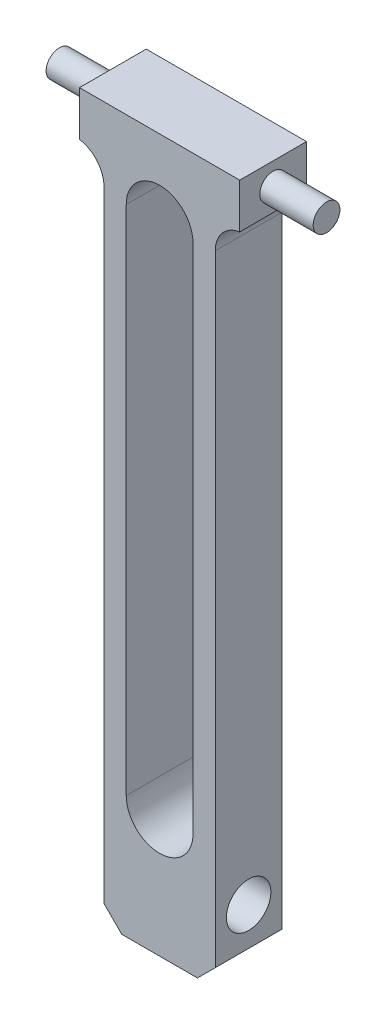
ISO-10303-21;
HEADER;
FILE_DESCRIPTION(('STEP AP214'),'2;1');
FILE_NAME('part.step','',(''),(''),'','','');
FILE_SCHEMA(('AUTOMOTIVE_DESIGN { 1 0 10303 214 1 1 1 1 }'));
ENDSEC;
DATA;
#1=APPLICATION_CONTEXT('core data for automotive mechanical design processes');
#2=APPLICATION_PROTOCOL_DEFINITION('international standard','automotive_design',2000,#1);
#3=PRODUCT_CONTEXT('',#1,'mechanical');
#4=PRODUCT('Part','Part','',(#3));
#5=PRODUCT_RELATED_PRODUCT_CATEGORY('part','',(#4));
#6=PRODUCT_DEFINITION_FORMATION('','',#4);
#7=PRODUCT_DEFINITION_CONTEXT('part definition',#1,'design');
#8=PRODUCT_DEFINITION('design','',#6,#7);
#9=PRODUCT_DEFINITION_SHAPE('','',#8);
#10=(LENGTH_UNIT() NAMED_UNIT(*) SI_UNIT(.MILLI.,.METRE.));
#11=(NAMED_UNIT(*) PLANE_ANGLE_UNIT() SI_UNIT($,.RADIAN.));
#12=(NAMED_UNIT(*) SI_UNIT($,.STERADIAN.) SOLID_ANGLE_UNIT());
#13=UNCERTAINTY_MEASURE_WITH_UNIT(LENGTH_MEASURE(1.E-05),#10,'distance_accuracy_value','');
#14=(GEOMETRIC_REPRESENTATION_CONTEXT(3) GLOBAL_UNCERTAINTY_ASSIGNED_CONTEXT((#13)) GLOBAL_UNIT_ASSIGNED_CONTEXT((#10,
#11,#12)) REPRESENTATION_CONTEXT('',''));
#15=CARTESIAN_POINT('',(0.,0.,0.));
#16=DIRECTION('',(0.,0.,1.));
#17=DIRECTION('',(1.,0.,0.));
#18=AXIS2_PLACEMENT_3D('',#15,#16,#17);
#19=CARTESIAN_POINT('',(-8.75,80.,7.5));
#20=DIRECTION('',(0.,-1.,0.));
#21=DIRECTION('',(0.,0.,-1.));
#22=AXIS2_PLACEMENT_3D('',#19,#20,#21);
#23=PLANE('',#22);
#24=DIRECTION('',(0.,0.,-1.));
#25=VECTOR('',#24,1.);
#26=CARTESIAN_POINT('',(-2.75,80.,7.5));
#27=LINE('',#26,#25);
#28=CARTESIAN_POINT('',(-2.75,80.,7.5));
#29=VERTEX_POINT('',#28);
#30=CARTESIAN_POINT('',(-2.75,80.,0.));
#31=VERTEX_POINT('',#30);
#32=EDGE_CURVE('E153',#29,#31,#27,.T.);
#33=ORIENTED_EDGE('',*,*,#32,.F.);
#34=DIRECTION('',(-1.,0.,0.));
#35=VECTOR('',#34,1.);
#36=CARTESIAN_POINT('',(-8.75,80.,7.5));
#37=LINE('',#36,#35);
#38=CARTESIAN_POINT('',(15.2499999999999,80.,7.5));
#39=VERTEX_POINT('',#38);
#40=EDGE_CURVE('E152',#39,#29,#37,.T.);
#41=ORIENTED_EDGE('',*,*,#40,.F.);
#42=DIRECTION('',(0.,0.,1.));
#43=VECTOR('',#42,1.);
#44=CARTESIAN_POINT('',(15.2499999999999,80.,7.5));
#45=LINE('',#44,#43);
#46=CARTESIAN_POINT('',(15.2499999999999,80.,0.));
#47=VERTEX_POINT('',#46);
#48=EDGE_CURVE('E280',#47,#39,#45,.T.);
#49=ORIENTED_EDGE('',*,*,#48,.F.);
#50=DIRECTION('',(-1.,0.,0.));
#51=VECTOR('',#50,1.);
#52=CARTESIAN_POINT('',(-8.75,80.,0.));
#53=LINE('',#52,#51);
#54=EDGE_CURVE('E178',#47,#31,#53,.T.);
#55=ORIENTED_EDGE('',*,*,#54,.T.);
#56=EDGE_LOOP('',(#33,#41,#49,#55));
#57=FACE_BOUND('',#56,.T.);
#58=ADVANCED_FACE('F41',(#57),#23,.F.);
#59=CARTESIAN_POINT('',(15.75,71.75,7.5));
#60=DIRECTION('',(0.,0.,1.));
#61=DIRECTION('',(1.,0.,0.));
#62=AXIS2_PLACEMENT_3D('',#59,#60,#61);
#63=PLANE('',#62);
#64=CARTESIAN_POINT('',(6.25,71.25,7.5));
#65=DIRECTION('',(0.,0.,1.));
#66=DIRECTION('',(1.,0.,0.));
#67=AXIS2_PLACEMENT_3D('',#64,#65,#66);
#68=CIRCLE('',#67,3.75);
#69=CARTESIAN_POINT('',(10.,71.25,7.5));
#70=VERTEX_POINT('',#69);
#71=CARTESIAN_POINT('',(2.50000000000001,71.25,7.5));
#72=VERTEX_POINT('',#71);
#73=EDGE_CURVE('E295',#70,#72,#68,.T.);
#74=ORIENTED_EDGE('',*,*,#73,.F.);
#75=DIRECTION('',(0.,1.,0.));
#76=VECTOR('',#75,1.);
#77=CARTESIAN_POINT('',(10.,71.25,7.5));
#78=LINE('',#77,#76);
#79=CARTESIAN_POINT('',(10.,13.75,7.5));
#80=VERTEX_POINT('',#79);
#81=EDGE_CURVE('E303',#80,#70,#78,.T.);
#82=ORIENTED_EDGE('',*,*,#81,.F.);
#83=CARTESIAN_POINT('',(6.25000000000001,13.75,7.5));
#84=DIRECTION('',(0.,0.,1.));
#85=DIRECTION('',(1.,0.,0.));
#86=AXIS2_PLACEMENT_3D('',#83,#84,#85);
#87=CIRCLE('',#86,3.75);
#88=CARTESIAN_POINT('',(2.50000000000001,13.75,7.5));
#89=VERTEX_POINT('',#88);
#90=EDGE_CURVE('E300',#89,#80,#87,.T.);
#91=ORIENTED_EDGE('',*,*,#90,.F.);
#92=DIRECTION('',(0.,-1.,0.));
#93=VECTOR('',#92,1.);
#94=CARTESIAN_POINT('',(2.5,71.25,7.5));
#95=LINE('',#94,#93);
#96=EDGE_CURVE('E297',#72,#89,#95,.T.);
#97=ORIENTED_EDGE('',*,*,#96,.F.);
#98=EDGE_LOOP('',(#74,#82,#91,#97));
#99=FACE_BOUND('',#98,.T.);
#100=ORIENTED_EDGE('',*,*,#40,.T.);
#101=DIRECTION('',(0.,-1.,0.));
#102=VECTOR('',#101,1.);
#103=CARTESIAN_POINT('',(-2.75,71.75,7.5));
#104=LINE('',#103,#102);
#105=CARTESIAN_POINT('',(-2.75,74.9613081446663,7.5));
#106=VERTEX_POINT('',#105);
#107=EDGE_CURVE('E140',#29,#106,#104,.T.);
#108=ORIENTED_EDGE('',*,*,#107,.T.);
#109=CARTESIAN_POINT('',(-3.25,71.75,7.5));
#110=DIRECTION('',(0.,0.,-1.));
#111=DIRECTION('',(-1.,0.,0.));
#112=AXIS2_PLACEMENT_3D('',#109,#110,#111);
#113=CIRCLE('',#112,3.25);
#114=CARTESIAN_POINT('',(0.,71.75,7.5));
#115=VERTEX_POINT('',#114);
#116=EDGE_CURVE('E148',#106,#115,#113,.T.);
#117=ORIENTED_EDGE('',*,*,#116,.T.);
#118=DIRECTION('',(0.,-1.,0.));
#119=VECTOR('',#118,1.);
#120=CARTESIAN_POINT('',(0.,2.,7.5));
#121=LINE('',#120,#119);
#122=CARTESIAN_POINT('',(0.,2.,7.5));
#123=VERTEX_POINT('',#122);
#124=EDGE_CURVE('E159',#115,#123,#121,.T.);
#125=ORIENTED_EDGE('',*,*,#124,.T.);
#126=DIRECTION('',(0.707106781186548,-0.707106781186548,0.));
#127=VECTOR('',#126,1.);
#128=CARTESIAN_POINT('',(0.,2.,7.5));
#129=LINE('',#128,#127);
#130=CARTESIAN_POINT('',(2.,0.,7.5));
#131=VERTEX_POINT('',#130);
#132=EDGE_CURVE('E161',#123,#131,#129,.T.);
#133=ORIENTED_EDGE('',*,*,#132,.T.);
#134=DIRECTION('',(1.,0.,0.));
#135=VECTOR('',#134,1.);
#136=CARTESIAN_POINT('',(2.,0.,7.5));
#137=LINE('',#136,#135);
#138=CARTESIAN_POINT('',(10.5,0.,7.5));
#139=VERTEX_POINT('',#138);
#140=EDGE_CURVE('E168',#131,#139,#137,.T.);
#141=ORIENTED_EDGE('',*,*,#140,.T.);
#142=DIRECTION('',(0.707106781186548,0.707106781186548,0.));
#143=VECTOR('',#142,1.);
#144=CARTESIAN_POINT('',(10.5,0.,7.5));
#145=LINE('',#144,#143);
#146=CARTESIAN_POINT('',(12.5,2.,7.5));
#147=VERTEX_POINT('',#146);
#148=EDGE_CURVE('E170',#139,#147,#145,.T.);
#149=ORIENTED_EDGE('',*,*,#148,.T.);
#150=DIRECTION('',(0.,1.,0.));
#151=VECTOR('',#150,1.);
#152=CARTESIAN_POINT('',(12.5,2.,7.5));
#153=LINE('',#152,#151);
#154=CARTESIAN_POINT('',(12.5,71.75,7.5));
#155=VERTEX_POINT('',#154);
#156=EDGE_CURVE('E172',#147,#155,#153,.T.);
#157=ORIENTED_EDGE('',*,*,#156,.T.);
#158=CARTESIAN_POINT('',(15.75,71.75,7.5));
#159=DIRECTION('',(0.,0.,-1.));
#160=DIRECTION('',(1.,0.,0.));
#161=AXIS2_PLACEMENT_3D('',#158,#159,#160);
#162=CIRCLE('',#161,3.25);
#163=CARTESIAN_POINT('',(15.2499999999999,74.9613081446663,7.5));
#164=VERTEX_POINT('',#163);
#165=EDGE_CURVE('E163',#155,#164,#162,.T.);
#166=ORIENTED_EDGE('',*,*,#165,.T.);
#167=DIRECTION('',(0.,1.,0.));
#168=VECTOR('',#167,1.);
#169=CARTESIAN_POINT('',(15.2499999999999,71.75,7.5));
#170=LINE('',#169,#168);
#171=EDGE_CURVE('E286',#164,#39,#170,.T.);
#172=ORIENTED_EDGE('',*,*,#171,.T.);
#173=EDGE_LOOP('',(#100,#108,#117,#125,#133,#141,#149,#157,#166,#172));
#174=FACE_BOUND('',#173,.T.);
#175=ADVANCED_FACE('F147',(#99,#174),#63,.T.);
#176=CARTESIAN_POINT('',(15.75,71.75,0.));
#177=DIRECTION('',(0.,0.,1.));
#178=DIRECTION('',(1.,0.,0.));
#179=AXIS2_PLACEMENT_3D('',#176,#177,#178);
#180=PLANE('',#179);
#181=DIRECTION('',(0.,1.,0.));
#182=VECTOR('',#181,1.);
#183=CARTESIAN_POINT('',(10.,71.75,0.));
#184=LINE('',#183,#182);
#185=CARTESIAN_POINT('',(10.,13.75,0.));
#186=VERTEX_POINT('',#185);
#187=CARTESIAN_POINT('',(10.,71.25,0.));
#188=VERTEX_POINT('',#187);
#189=EDGE_CURVE('E215',#186,#188,#184,.T.);
#190=ORIENTED_EDGE('',*,*,#189,.T.);
#191=CARTESIAN_POINT('',(6.25,71.25,0.));
#192=DIRECTION('',(0.,0.,1.));
#193=DIRECTION('',(1.,0.,0.));
#194=AXIS2_PLACEMENT_3D('',#191,#192,#193);
#195=CIRCLE('',#194,3.75);
#196=CARTESIAN_POINT('',(2.5,71.25,0.));
#197=VERTEX_POINT('',#196);
#198=EDGE_CURVE('E218',#188,#197,#195,.T.);
#199=ORIENTED_EDGE('',*,*,#198,.T.);
#200=DIRECTION('',(0.,-1.,0.));
#201=VECTOR('',#200,1.);
#202=CARTESIAN_POINT('',(2.50000000000001,71.75,0.));
#203=LINE('',#202,#201);
#204=CARTESIAN_POINT('',(2.50000000000001,13.75,0.));
#205=VERTEX_POINT('',#204);
#206=EDGE_CURVE('E209',#197,#205,#203,.T.);
#207=ORIENTED_EDGE('',*,*,#206,.T.);
#208=CARTESIAN_POINT('',(6.25000000000001,13.75,0.));
#209=DIRECTION('',(0.,0.,1.));
#210=DIRECTION('',(1.,0.,0.));
#211=AXIS2_PLACEMENT_3D('',#208,#209,#210);
#212=CIRCLE('',#211,3.75);
#213=EDGE_CURVE('E212',#205,#186,#212,.T.);
#214=ORIENTED_EDGE('',*,*,#213,.T.);
#215=EDGE_LOOP('',(#190,#199,#207,#214));
#216=FACE_BOUND('',#215,.T.);
#217=DIRECTION('',(0.,-1.,0.));
#218=VECTOR('',#217,1.);
#219=CARTESIAN_POINT('',(-2.75,71.75,0.));
#220=LINE('',#219,#218);
#221=CARTESIAN_POINT('',(-2.75,74.9613081446663,0.));
#222=VERTEX_POINT('',#221);
#223=EDGE_CURVE('E55',#31,#222,#220,.T.);
#224=ORIENTED_EDGE('',*,*,#223,.F.);
#225=ORIENTED_EDGE('',*,*,#54,.F.);
#226=DIRECTION('',(0.,1.,0.));
#227=VECTOR('',#226,1.);
#228=CARTESIAN_POINT('',(15.2499999999999,71.75,0.));
#229=LINE('',#228,#227);
#230=CARTESIAN_POINT('',(15.2499999999999,74.9613081446663,0.));
#231=VERTEX_POINT('',#230);
#232=EDGE_CURVE('E49',#231,#47,#229,.T.);
#233=ORIENTED_EDGE('',*,*,#232,.F.);
#234=CARTESIAN_POINT('',(15.75,71.75,0.));
#235=DIRECTION('',(0.,0.,-1.));
#236=DIRECTION('',(1.,0.,0.));
#237=AXIS2_PLACEMENT_3D('',#234,#235,#236);
#238=CIRCLE('',#237,3.25);
#239=CARTESIAN_POINT('',(12.5,71.75,0.));
#240=VERTEX_POINT('',#239);
#241=EDGE_CURVE('E175',#240,#231,#238,.T.);
#242=ORIENTED_EDGE('',*,*,#241,.F.);
#243=DIRECTION('',(0.,1.,0.));
#244=VECTOR('',#243,1.);
#245=CARTESIAN_POINT('',(12.5,2.,0.));
#246=LINE('',#245,#244);
#247=CARTESIAN_POINT('',(12.5,2.,0.));
#248=VERTEX_POINT('',#247);
#249=EDGE_CURVE('E192',#248,#240,#246,.T.);
#250=ORIENTED_EDGE('',*,*,#249,.F.);
#251=DIRECTION('',(0.707106781186548,0.707106781186548,0.));
#252=VECTOR('',#251,1.);
#253=CARTESIAN_POINT('',(10.5,0.,0.));
#254=LINE('',#253,#252);
#255=CARTESIAN_POINT('',(10.5,0.,0.));
#256=VERTEX_POINT('',#255);
#257=EDGE_CURVE('E190',#256,#248,#254,.T.);
#258=ORIENTED_EDGE('',*,*,#257,.F.);
#259=DIRECTION('',(1.,0.,0.));
#260=VECTOR('',#259,1.);
#261=CARTESIAN_POINT('',(2.,0.,0.));
#262=LINE('',#261,#260);
#263=CARTESIAN_POINT('',(2.,0.,0.));
#264=VERTEX_POINT('',#263);
#265=EDGE_CURVE('E188',#264,#256,#262,.T.);
#266=ORIENTED_EDGE('',*,*,#265,.F.);
#267=DIRECTION('',(0.707106781186548,-0.707106781186548,0.));
#268=VECTOR('',#267,1.);
#269=CARTESIAN_POINT('',(0.,2.,0.));
#270=LINE('',#269,#268);
#271=CARTESIAN_POINT('',(0.,2.,0.));
#272=VERTEX_POINT('',#271);
#273=EDGE_CURVE('E186',#272,#264,#270,.T.);
#274=ORIENTED_EDGE('',*,*,#273,.F.);
#275=DIRECTION('',(0.,-1.,0.));
#276=VECTOR('',#275,1.);
#277=CARTESIAN_POINT('',(0.,2.,0.));
#278=LINE('',#277,#276);
#279=CARTESIAN_POINT('',(0.,71.75,0.));
#280=VERTEX_POINT('',#279);
#281=EDGE_CURVE('E184',#280,#272,#278,.T.);
#282=ORIENTED_EDGE('',*,*,#281,.F.);
#283=CARTESIAN_POINT('',(-3.25,71.75,0.));
#284=DIRECTION('',(0.,0.,-1.));
#285=DIRECTION('',(-1.,0.,0.));
#286=AXIS2_PLACEMENT_3D('',#283,#284,#285);
#287=CIRCLE('',#286,3.25);
#288=EDGE_CURVE('E182',#222,#280,#287,.T.);
#289=ORIENTED_EDGE('',*,*,#288,.F.);
#290=EDGE_LOOP('',(#224,#225,#233,#242,#250,#258,#266,#274,#282,#289));
#291=FACE_BOUND('',#290,.T.);
#292=ADVANCED_FACE('F265',(#216,#291),#180,.F.);
#293=CARTESIAN_POINT('',(-3.25,71.75,7.5));
#294=DIRECTION('',(0.,0.,-1.));
#295=DIRECTION('',(-1.,0.,0.));
#296=AXIS2_PLACEMENT_3D('',#293,#294,#295);
#297=CYLINDRICAL_SURFACE('',#296,3.25);
#298=DIRECTION('',(0.,0.,-1.));
#299=VECTOR('',#298,1.);
#300=CARTESIAN_POINT('',(-2.75,74.9613081446663,7.5));
#301=LINE('',#300,#299);
#302=EDGE_CURVE('E13',#222,#106,#301,.F.);
#303=ORIENTED_EDGE('',*,*,#302,.F.);
#304=ORIENTED_EDGE('',*,*,#288,.T.);
#305=DIRECTION('',(0.,0.,-1.));
#306=VECTOR('',#305,1.);
#307=CARTESIAN_POINT('',(0.,71.75,7.5));
#308=LINE('',#307,#306);
#309=EDGE_CURVE('E157',#115,#280,#308,.T.);
#310=ORIENTED_EDGE('',*,*,#309,.F.);
#311=ORIENTED_EDGE('',*,*,#116,.F.);
#312=EDGE_LOOP('',(#303,#304,#310,#311));
#313=FACE_BOUND('',#312,.T.);
#314=ADVANCED_FACE('F155',(#313),#297,.F.);
#315=CARTESIAN_POINT('',(15.75,71.75,7.5));
#316=DIRECTION('',(0.,0.,-1.));
#317=DIRECTION('',(-1.,0.,0.));
#318=AXIS2_PLACEMENT_3D('',#315,#316,#317);
#319=CYLINDRICAL_SURFACE('',#318,3.25);
#320=DIRECTION('',(0.,0.,-1.));
#321=VECTOR('',#320,1.);
#322=CARTESIAN_POINT('',(15.2499999999999,74.9613081446663,7.5));
#323=LINE('',#322,#321);
#324=EDGE_CURVE('E63',#164,#231,#323,.T.);
#325=ORIENTED_EDGE('',*,*,#324,.F.);
#326=ORIENTED_EDGE('',*,*,#165,.F.);
#327=DIRECTION('',(0.,0.,-1.));
#328=VECTOR('',#327,1.);
#329=CARTESIAN_POINT('',(12.5,71.75,7.5));
#330=LINE('',#329,#328);
#331=EDGE_CURVE('E174',#155,#240,#330,.T.);
#332=ORIENTED_EDGE('',*,*,#331,.T.);
#333=ORIENTED_EDGE('',*,*,#241,.T.);
#334=EDGE_LOOP('',(#325,#326,#332,#333));
#335=FACE_BOUND('',#334,.T.);
#336=ADVANCED_FACE('F43',(#335),#319,.F.);
#337=CARTESIAN_POINT('',(0.,2.,7.5));
#338=DIRECTION('',(1.,0.,0.));
#339=DIRECTION('',(0.,0.,-1.));
#340=AXIS2_PLACEMENT_3D('',#337,#338,#339);
#341=PLANE('',#340);
#342=CARTESIAN_POINT('',(0.,6.25,3.75));
#343=DIRECTION('',(1.,0.,0.));
#344=DIRECTION('',(0.,0.,-1.));
#345=AXIS2_PLACEMENT_3D('',#342,#343,#344);
#346=CIRCLE('',#345,2.5);
#347=CARTESIAN_POINT('',(0.,6.25,1.25));
#348=VERTEX_POINT('',#347);
#349=EDGE_CURVE('E292',#348,#348,#346,.T.);
#350=ORIENTED_EDGE('',*,*,#349,.T.);
#351=EDGE_LOOP('',(#350));
#352=FACE_BOUND('',#351,.T.);
#353=ORIENTED_EDGE('',*,*,#281,.T.);
#354=DIRECTION('',(0.,0.,-1.));
#355=VECTOR('',#354,1.);
#356=CARTESIAN_POINT('',(0.,2.,7.5));
#357=LINE('',#356,#355);
#358=EDGE_CURVE('E205',#123,#272,#357,.T.);
#359=ORIENTED_EDGE('',*,*,#358,.F.);
#360=ORIENTED_EDGE('',*,*,#124,.F.);
#361=ORIENTED_EDGE('',*,*,#309,.T.);
#362=EDGE_LOOP('',(#353,#359,#360,#361));
#363=FACE_BOUND('',#362,.T.);
#364=ADVANCED_FACE('F336',(#352,#363),#341,.F.);
#365=CARTESIAN_POINT('',(0.,2.,7.5));
#366=DIRECTION('',(0.707106781186547,0.707106781186547,0.));
#367=DIRECTION('',(-0.707106781186548,0.707106781186548,0.));
#368=AXIS2_PLACEMENT_3D('',#365,#366,#367);
#369=PLANE('',#368);
#370=ORIENTED_EDGE('',*,*,#273,.T.);
#371=DIRECTION('',(0.,0.,-1.));
#372=VECTOR('',#371,1.);
#373=CARTESIAN_POINT('',(2.,0.,7.5));
#374=LINE('',#373,#372);
#375=EDGE_CURVE('E202',#131,#264,#374,.T.);
#376=ORIENTED_EDGE('',*,*,#375,.F.);
#377=ORIENTED_EDGE('',*,*,#132,.F.);
#378=ORIENTED_EDGE('',*,*,#358,.T.);
#379=EDGE_LOOP('',(#370,#376,#377,#378));
#380=FACE_BOUND('',#379,.T.);
#381=ADVANCED_FACE('F343',(#380),#369,.F.);
#382=CARTESIAN_POINT('',(2.,0.,7.5));
#383=DIRECTION('',(0.,1.,0.));
#384=DIRECTION('',(0.,0.,1.));
#385=AXIS2_PLACEMENT_3D('',#382,#383,#384);
#386=PLANE('',#385);
#387=CARTESIAN_POINT('',(6.25,0.,3.75));
#388=DIRECTION('',(0.,-1.,0.));
#389=DIRECTION('',(0.,0.,-1.));
#390=AXIS2_PLACEMENT_3D('',#387,#388,#389);
#391=CIRCLE('',#390,1.65);
#392=CARTESIAN_POINT('',(6.25,0.,2.1));
#393=VERTEX_POINT('',#392);
#394=EDGE_CURVE('E228',#393,#393,#391,.T.);
#395=ORIENTED_EDGE('',*,*,#394,.F.);
#396=EDGE_LOOP('',(#395));
#397=FACE_BOUND('',#396,.T.);
#398=ORIENTED_EDGE('',*,*,#265,.T.);
#399=DIRECTION('',(0.,0.,-1.));
#400=VECTOR('',#399,1.);
#401=CARTESIAN_POINT('',(10.5,0.,7.5));
#402=LINE('',#401,#400);
#403=EDGE_CURVE('E199',#139,#256,#402,.T.);
#404=ORIENTED_EDGE('',*,*,#403,.F.);
#405=ORIENTED_EDGE('',*,*,#140,.F.);
#406=ORIENTED_EDGE('',*,*,#375,.T.);
#407=EDGE_LOOP('',(#398,#404,#405,#406));
#408=FACE_BOUND('',#407,.T.);
#409=ADVANCED_FACE('F346',(#397,#408),#386,.F.);
#410=CARTESIAN_POINT('',(10.5,0.,7.5));
#411=DIRECTION('',(-0.707106781186547,0.707106781186547,0.));
#412=DIRECTION('',(-0.707106781186548,-0.707106781186548,0.));
#413=AXIS2_PLACEMENT_3D('',#410,#411,#412);
#414=PLANE('',#413);
#415=ORIENTED_EDGE('',*,*,#257,.T.);
#416=DIRECTION('',(0.,0.,-1.));
#417=VECTOR('',#416,1.);
#418=CARTESIAN_POINT('',(12.5,2.,7.5));
#419=LINE('',#418,#417);
#420=EDGE_CURVE('E196',#147,#248,#419,.T.);
#421=ORIENTED_EDGE('',*,*,#420,.F.);
#422=ORIENTED_EDGE('',*,*,#148,.F.);
#423=ORIENTED_EDGE('',*,*,#403,.T.);
#424=EDGE_LOOP('',(#415,#421,#422,#423));
#425=FACE_BOUND('',#424,.T.);
#426=ADVANCED_FACE('F350',(#425),#414,.F.);
#427=CARTESIAN_POINT('',(12.5,2.,7.5));
#428=DIRECTION('',(-1.,0.,0.));
#429=DIRECTION('',(0.,0.,1.));
#430=AXIS2_PLACEMENT_3D('',#427,#428,#429);
#431=PLANE('',#430);
#432=CARTESIAN_POINT('',(12.5,6.25,3.75));
#433=DIRECTION('',(1.,0.,0.));
#434=DIRECTION('',(0.,1.,0.));
#435=AXIS2_PLACEMENT_3D('',#432,#433,#434);
#436=CIRCLE('',#435,2.5);
#437=CARTESIAN_POINT('',(12.5,8.75,3.75));
#438=VERTEX_POINT('',#437);
#439=EDGE_CURVE('E227',#438,#438,#436,.T.);
#440=ORIENTED_EDGE('',*,*,#439,.F.);
#441=EDGE_LOOP('',(#440));
#442=FACE_BOUND('',#441,.T.);
#443=ORIENTED_EDGE('',*,*,#249,.T.);
#444=ORIENTED_EDGE('',*,*,#331,.F.);
#445=ORIENTED_EDGE('',*,*,#156,.F.);
#446=ORIENTED_EDGE('',*,*,#420,.T.);
#447=EDGE_LOOP('',(#443,#444,#445,#446));
#448=FACE_BOUND('',#447,.T.);
#449=ADVANCED_FACE('F352',(#442,#448),#431,.F.);
#450=CARTESIAN_POINT('',(6.25,71.25,-2.5));
#451=DIRECTION('',(0.,0.,1.));
#452=DIRECTION('',(1.,0.,0.));
#453=AXIS2_PLACEMENT_3D('',#450,#451,#452);
#454=CYLINDRICAL_SURFACE('',#453,3.75);
#455=DIRECTION('',(0.,0.,1.));
#456=VECTOR('',#455,1.);
#457=CARTESIAN_POINT('',(10.,71.25,-2.5));
#458=LINE('',#457,#456);
#459=EDGE_CURVE('E179',#188,#70,#458,.T.);
#460=ORIENTED_EDGE('',*,*,#459,.T.);
#461=ORIENTED_EDGE('',*,*,#73,.T.);
#462=DIRECTION('',(0.,0.,1.));
#463=VECTOR('',#462,1.);
#464=CARTESIAN_POINT('',(2.5,71.25,-2.5));
#465=LINE('',#464,#463);
#466=EDGE_CURVE('E306',#197,#72,#465,.T.);
#467=ORIENTED_EDGE('',*,*,#466,.F.);
#468=ORIENTED_EDGE('',*,*,#198,.F.);
#469=EDGE_LOOP('',(#460,#461,#467,#468));
#470=FACE_BOUND('',#469,.T.);
#471=ADVANCED_FACE('F354',(#470),#454,.F.);
#472=CARTESIAN_POINT('',(10.,71.25,-2.5));
#473=DIRECTION('',(1.,0.,0.));
#474=DIRECTION('',(0.,1.,0.));
#475=AXIS2_PLACEMENT_3D('',#472,#473,#474);
#476=PLANE('',#475);
#477=DIRECTION('',(0.,0.,1.));
#478=VECTOR('',#477,1.);
#479=CARTESIAN_POINT('',(10.,13.75,-2.5));
#480=LINE('',#479,#478);
#481=EDGE_CURVE('E308',#186,#80,#480,.T.);
#482=ORIENTED_EDGE('',*,*,#481,.T.);
#483=ORIENTED_EDGE('',*,*,#81,.T.);
#484=ORIENTED_EDGE('',*,*,#459,.F.);
#485=ORIENTED_EDGE('',*,*,#189,.F.);
#486=EDGE_LOOP('',(#482,#483,#484,#485));
#487=FACE_BOUND('',#486,.T.);
#488=ADVANCED_FACE('F361',(#487),#476,.F.);
#489=CARTESIAN_POINT('',(6.25000000000001,13.75,-2.5));
#490=DIRECTION('',(0.,0.,1.));
#491=DIRECTION('',(1.,0.,0.));
#492=AXIS2_PLACEMENT_3D('',#489,#490,#491);
#493=CYLINDRICAL_SURFACE('',#492,3.75);
#494=DIRECTION('',(0.,0.,1.));
#495=VECTOR('',#494,1.);
#496=CARTESIAN_POINT('',(2.50000000000001,13.75,-2.5));
#497=LINE('',#496,#495);
#498=EDGE_CURVE('E310',#205,#89,#497,.T.);
#499=ORIENTED_EDGE('',*,*,#498,.T.);
#500=ORIENTED_EDGE('',*,*,#90,.T.);
#501=ORIENTED_EDGE('',*,*,#481,.F.);
#502=ORIENTED_EDGE('',*,*,#213,.F.);
#503=EDGE_LOOP('',(#499,#500,#501,#502));
#504=FACE_BOUND('',#503,.T.);
#505=ADVANCED_FACE('F388',(#504),#493,.F.);
#506=CARTESIAN_POINT('',(2.5,71.25,-2.5));
#507=DIRECTION('',(-1.,0.,0.));
#508=DIRECTION('',(0.,-1.,0.));
#509=AXIS2_PLACEMENT_3D('',#506,#507,#508);
#510=PLANE('',#509);
#511=ORIENTED_EDGE('',*,*,#466,.T.);
#512=ORIENTED_EDGE('',*,*,#96,.T.);
#513=ORIENTED_EDGE('',*,*,#498,.F.);
#514=ORIENTED_EDGE('',*,*,#206,.F.);
#515=EDGE_LOOP('',(#511,#512,#513,#514));
#516=FACE_BOUND('',#515,.T.);
#517=ADVANCED_FACE('F395',(#516),#510,.F.);
#518=CARTESIAN_POINT('',(-8.75,6.25,3.75));
#519=DIRECTION('',(1.,0.,0.));
#520=DIRECTION('',(0.,1.,0.));
#521=AXIS2_PLACEMENT_3D('',#518,#519,#520);
#522=CYLINDRICAL_SURFACE('',#521,2.5);
#523=CARTESIAN_POINT('',(6.25,4.3718360029007,2.1));
#524=CARTESIAN_POINT('',(6.33079427655975,4.37182643259133,2.10000556927834));
#525=CARTESIAN_POINT('',(6.41162636905579,4.36652581717207,2.10598550628885));
#526=CARTESIAN_POINT('',(6.57041795060532,4.34634247758167,2.12941139749378));
#527=CARTESIAN_POINT('',(6.64837201591593,4.33144254951039,2.14687793916521));
#528=CARTESIAN_POINT('',(6.79863333158224,4.29469387243452,2.1919227246143));
#529=CARTESIAN_POINT('',(6.87098643150526,4.27291116781144,2.21940522873516));
#530=CARTESIAN_POINT('',(7.00994524738078,4.22496785724555,2.28342482258675));
#531=CARTESIAN_POINT('',(7.07654970122849,4.19880629361915,2.31996389388724));
#532=CARTESIAN_POINT('',(7.21321736687682,4.14028171437081,2.407516406981));
#533=CARTESIAN_POINT('',(7.28226727651007,4.10758053610633,2.45988579529906));
#534=CARTESIAN_POINT('',(7.41147714614391,4.04241778412018,2.57485855531519));
#535=CARTESIAN_POINT('',(7.47162860029669,4.00995646747137,2.63747159987501));
#536=CARTESIAN_POINT('',(7.58973271619889,3.9435580232284,2.78176508432311));
#537=CARTESIAN_POINT('',(7.64619090363769,3.91005359396183,2.86488835195808));
#538=CARTESIAN_POINT('',(7.74384115428655,3.85050706248544,3.04209100296853));
#539=CARTESIAN_POINT('',(7.78504992824282,3.82445679892955,3.13615824409806));
#540=CARTESIAN_POINT('',(7.84607361226672,3.78535646485073,3.32163446336672));
#541=CARTESIAN_POINT('',(7.86774914948944,3.77118808608697,3.41218892754831));
#542=CARTESIAN_POINT('',(7.89549014711654,3.75299733483391,3.59661929507354));
#543=CARTESIAN_POINT('',(7.90157471024375,3.74896254636032,3.69049099082643));
#544=CARTESIAN_POINT('',(7.89800862462096,3.75131270340461,3.8637126636379));
#545=CARTESIAN_POINT('',(7.89056933208685,3.75623343157417,3.94314050029094));
#546=CARTESIAN_POINT('',(7.86453692457822,3.77328201033626,4.09933830819111));
#547=CARTESIAN_POINT('',(7.84594298850181,3.78541039148905,4.17610808333622));
#548=CARTESIAN_POINT('',(7.79858528412734,3.8158083267573,4.32486241957616));
#549=CARTESIAN_POINT('',(7.76985022722839,3.83406053605431,4.39685981558046));
#550=CARTESIAN_POINT('',(7.70331789592823,3.87535195413217,4.53501703450329));
#551=CARTESIAN_POINT('',(7.6655189106069,3.89839206657482,4.60117575207516));
#552=CARTESIAN_POINT('',(7.5764481916351,3.95097754998643,4.73504700079131));
#553=CARTESIAN_POINT('',(7.52406230137878,3.98097943580155,4.80183695764556));
#554=CARTESIAN_POINT('',(7.41019022775839,4.0429078108246,4.92625968695308));
#555=CARTESIAN_POINT('',(7.34869006733423,4.07483721056835,4.98387810796581));
#556=CARTESIAN_POINT('',(7.20750690257425,4.14288951687365,5.09724934289722));
#557=CARTESIAN_POINT('',(7.12648069757491,4.17891571586504,5.15139996434747));
#558=CARTESIAN_POINT('',(6.95447022283534,4.24562042340631,5.24525229324493));
#559=CARTESIAN_POINT('',(6.8635034211415,4.276308074664,5.28497883258692));
#560=CARTESIAN_POINT('',(6.70004901179961,4.31978793765181,5.33906609884217));
#561=CARTESIAN_POINT('',(6.62958306194073,4.33518623606594,5.35742065844978));
#562=CARTESIAN_POINT('',(6.48568483824098,4.35843037512274,5.38471528383589));
#563=CARTESIAN_POINT('',(6.41225774603094,4.36628885885,5.39367111218458));
#564=CARTESIAN_POINT('',(6.26413898103529,4.3732436450003,5.40161100823905));
#565=CARTESIAN_POINT('',(6.18944345582033,4.37230517573112,5.40055550398267));
#566=CARTESIAN_POINT('',(6.04146670785288,4.36174085276623,5.38845508785891));
#567=CARTESIAN_POINT('',(5.96818670082213,4.35210784344964,5.37740194790477));
#568=CARTESIAN_POINT('',(5.82815606994752,4.32622679211729,5.34670654181038));
#569=CARTESIAN_POINT('',(5.7612601566981,4.3102817057114,5.32745493961549));
#570=CARTESIAN_POINT('',(5.63158821030647,4.27362524804285,5.28127715983158));
#571=CARTESIAN_POINT('',(5.56881355184297,4.25291229669646,5.2543484373163));
#572=CARTESIAN_POINT('',(5.43584653371123,4.2040797596147,5.18744371796296));
#573=CARTESIAN_POINT('',(5.36666627761783,4.17530661650061,5.14593741519331));
#574=CARTESIAN_POINT('',(5.2354540035836,4.11613692773855,5.05370192953133));
#575=CARTESIAN_POINT('',(5.17343083426984,4.08573843909979,5.00296152557762));
#576=CARTESIAN_POINT('',(5.04502279309446,4.01933895700838,4.88132559349667));
#577=CARTESIAN_POINT('',(4.98042825569478,3.98349247141671,4.80843368437051));
#578=CARTESIAN_POINT('',(4.86429294484174,3.91645258451014,4.65102913614524));
#579=CARTESIAN_POINT('',(4.81273983785047,3.88525479839333,4.56652759412081));
#580=CARTESIAN_POINT('',(4.73346296196824,3.83616071522342,4.40502243694462));
#581=CARTESIAN_POINT('',(4.70305320616478,3.81685705394067,4.3297669827615));
#582=CARTESIAN_POINT('',(4.65340770004291,3.78499655796554,4.1743057177981));
#583=CARTESIAN_POINT('',(4.63416259316717,3.77243407447936,4.09410411469772));
#584=CARTESIAN_POINT('',(4.60780779187865,3.75516640805195,3.93053205750148));
#585=CARTESIAN_POINT('',(4.60074836698325,3.7504937747787,3.84714992034681));
#586=CARTESIAN_POINT('',(4.59936521725824,3.74958119008567,3.68022969531136));
#587=CARTESIAN_POINT('',(4.60504091284883,3.75334085490904,3.5966916147005));
#588=CARTESIAN_POINT('',(4.6279594817533,3.76837775508636,3.43775115793134));
#589=CARTESIAN_POINT('',(4.64439826797344,3.77913208843802,3.36217959416177));
#590=CARTESIAN_POINT('',(4.68722616352496,3.80674502509381,3.2151090434188));
#591=CARTESIAN_POINT('',(4.71361683656131,3.82360458767459,3.14361069848922));
#592=CARTESIAN_POINT('',(4.77725696718864,3.86340901477185,3.00170026893001));
#593=CARTESIAN_POINT('',(4.81508395318078,3.88666937511893,2.93163794911275));
#594=CARTESIAN_POINT('',(4.89960758414192,3.93701335239296,2.79860026507972));
#595=CARTESIAN_POINT('',(4.94630996063964,3.9640994369686,2.73562952252761));
#596=CARTESIAN_POINT('',(5.05552907515257,4.0247186725103,2.60813723165182));
#597=CARTESIAN_POINT('',(5.11937720174745,4.05859689635048,2.54491968270823));
#598=CARTESIAN_POINT('',(5.25656834044152,4.12612705977143,2.42953232398288));
#599=CARTESIAN_POINT('',(5.32991747200144,4.15977883867854,2.37736969209585));
#600=CARTESIAN_POINT('',(5.47797320198262,4.22036814813585,2.28946264257517));
#601=CARTESIAN_POINT('',(5.55189495776456,4.2476396917269,2.25263186795495));
#602=CARTESIAN_POINT('',(5.70610913288328,4.29602947321158,2.19000876747695));
#603=CARTESIAN_POINT('',(5.78638751989308,4.31716080896156,2.16419288945764));
#604=CARTESIAN_POINT('',(5.93069139681369,4.34584324285308,2.12995264853043));
#605=CARTESIAN_POINT('',(5.99364690760695,4.35548259517548,2.11877309307303));
#606=CARTESIAN_POINT('',(6.12106080182247,4.36848110393648,2.10379653339006));
#607=CARTESIAN_POINT('',(6.18551835732424,4.37184364093269,2.09999555517754));
#608=CARTESIAN_POINT('',(6.25,4.3718360029007,2.1));
#609=B_SPLINE_CURVE_WITH_KNOTS('',3,(#523,#524,#525,#526,#527,#528,#529,#530,#531,#532,#533,
#534,#535,#536,#537,#538,#539,#540,#541,#542,#543,#544,#545,#546,#547,#548,#549,#550,#551,#552,
#553,#554,#555,#556,#557,#558,#559,#560,#561,#562,#563,#564,#565,#566,#567,#568,#569,#570,#571,
#572,#573,#574,#575,#576,#577,#578,#579,#580,#581,#582,#583,#584,#585,#586,#587,#588,#589,#590,
#591,#592,#593,#594,#595,#596,#597,#598,#599,#600,#601,#602,#603,#604,#605,#606,#607,#608),
.UNSPECIFIED.,.T.,.F.,(4,2,2,2,2,2,2,2,2,2,2,2,2,2,2,2,2,2,2,2,2,2,2,2,2,2,2,2,2,2,2,2,2,2,2,2,
2,2,2,2,2,2,4),(0.,0.24208908923221,0.484613262365226,0.72487754222912,0.965194438206267,
1.24204242334406,1.51915335508711,1.83517136959405,2.15084204970881,2.43163690958526,
2.71208756281943,2.9507129324479,3.18935586962918,3.4273285139579,3.66534611375404,
3.93440451568684,4.203879881767,4.51414003592555,4.8238634978649,5.0462567712386,
5.26827647088754,5.49117411610793,5.71425537389903,5.92772322794785,6.14126192794926,
6.39732261532283,6.65369656488884,6.96356575078111,7.27314078239638,7.5223841368641,
7.77141830954323,8.02147738775787,8.27152508592674,8.50474641601319,8.73800440662636,
8.98590102363146,9.23395827408611,9.52089661145363,9.80802068929723,10.067982581361,
10.3273858003361,10.520700440269,10.7139109350251),.UNSPECIFIED.);
#610=CARTESIAN_POINT('',(6.25,4.3718360029007,2.1));
#611=VERTEX_POINT('',#610);
#612=EDGE_CURVE('E221',#611,#611,#609,.T.);
#613=ORIENTED_EDGE('',*,*,#612,.T.);
#614=EDGE_LOOP('',(#613));
#615=FACE_BOUND('',#614,.T.);
#616=ORIENTED_EDGE('',*,*,#439,.T.);
#617=EDGE_LOOP('',(#616));
#618=FACE_BOUND('',#617,.T.);
#619=ORIENTED_EDGE('',*,*,#349,.F.);
#620=EDGE_LOOP('',(#619));
#621=FACE_BOUND('',#620,.T.);
#622=ADVANCED_FACE('F229',(#615,#618,#621),#522,.F.);
#623=CARTESIAN_POINT('',(6.25,0.,3.75));
#624=DIRECTION('',(0.,-1.,0.));
#625=DIRECTION('',(0.,0.,-1.));
#626=AXIS2_PLACEMENT_3D('',#623,#624,#625);
#627=CYLINDRICAL_SURFACE('',#626,1.65);
#628=ORIENTED_EDGE('',*,*,#394,.T.);
#629=EDGE_LOOP('',(#628));
#630=FACE_BOUND('',#629,.T.);
#631=ORIENTED_EDGE('',*,*,#612,.F.);
#632=EDGE_LOOP('',(#631));
#633=FACE_BOUND('',#632,.T.);
#634=ADVANCED_FACE('F232',(#630,#633),#627,.F.);
#635=CARTESIAN_POINT('',(15.2499999999999,40.,3.75));
#636=DIRECTION('',(1.,0.,0.));
#637=DIRECTION('',(0.,0.,-1.));
#638=AXIS2_PLACEMENT_3D('',#635,#636,#637);
#639=PLANE('',#638);
#640=ORIENTED_EDGE('',*,*,#324,.T.);
#641=ORIENTED_EDGE('',*,*,#232,.T.);
#642=ORIENTED_EDGE('',*,*,#48,.T.);
#643=ORIENTED_EDGE('',*,*,#171,.F.);
#644=EDGE_LOOP('',(#640,#641,#642,#643));
#645=FACE_BOUND('',#644,.T.);
#646=CARTESIAN_POINT('',(15.2499999999999,77.5,3.75));
#647=DIRECTION('',(1.,0.,0.));
#648=DIRECTION('',(0.,0.,-1.));
#649=AXIS2_PLACEMENT_3D('',#646,#647,#648);
#650=CIRCLE('',#649,1.5);
#651=CARTESIAN_POINT('',(15.2499999999999,77.5,2.25));
#652=VERTEX_POINT('',#651);
#653=EDGE_CURVE('E277',#652,#652,#650,.T.);
#654=ORIENTED_EDGE('',*,*,#653,.F.);
#655=EDGE_LOOP('',(#654));
#656=FACE_BOUND('',#655,.T.);
#657=ADVANCED_FACE('F236',(#645,#656),#639,.T.);
#658=CARTESIAN_POINT('',(15.2499999999999,77.5,3.75));
#659=DIRECTION('',(1.,0.,0.));
#660=DIRECTION('',(0.,0.,-1.));
#661=AXIS2_PLACEMENT_3D('',#658,#659,#660);
#662=CYLINDRICAL_SURFACE('',#661,1.5);
#663=ORIENTED_EDGE('',*,*,#653,.T.);
#664=EDGE_LOOP('',(#663));
#665=FACE_BOUND('',#664,.T.);
#666=CARTESIAN_POINT('',(21.2499999999999,77.5,3.75));
#667=DIRECTION('',(1.,0.,0.));
#668=DIRECTION('',(0.,0.,-1.));
#669=AXIS2_PLACEMENT_3D('',#666,#667,#668);
#670=CIRCLE('',#669,1.5);
#671=CARTESIAN_POINT('',(21.2499999999999,77.5,2.25));
#672=VERTEX_POINT('',#671);
#673=EDGE_CURVE('E275',#672,#672,#670,.T.);
#674=ORIENTED_EDGE('',*,*,#673,.F.);
#675=EDGE_LOOP('',(#674));
#676=FACE_BOUND('',#675,.T.);
#677=ADVANCED_FACE('F240',(#665,#676),#662,.T.);
#678=CARTESIAN_POINT('',(21.25,80.,7.5));
#679=DIRECTION('',(-1.,0.,0.));
#680=DIRECTION('',(0.,-1.,0.));
#681=AXIS2_PLACEMENT_3D('',#678,#679,#680);
#682=PLANE('',#681);
#683=ORIENTED_EDGE('',*,*,#673,.T.);
#684=EDGE_LOOP('',(#683));
#685=FACE_BOUND('',#684,.T.);
#686=ADVANCED_FACE('F243',(#685),#682,.F.);
#687=CARTESIAN_POINT('',(-2.75,40.,3.75));
#688=DIRECTION('',(-1.,0.,0.));
#689=DIRECTION('',(0.,0.,1.));
#690=AXIS2_PLACEMENT_3D('',#687,#688,#689);
#691=PLANE('',#690);
#692=CARTESIAN_POINT('',(-2.75,77.5,3.75));
#693=DIRECTION('',(-1.,0.,0.));
#694=DIRECTION('',(0.,0.,1.));
#695=AXIS2_PLACEMENT_3D('',#692,#693,#694);
#696=CIRCLE('',#695,1.5);
#697=CARTESIAN_POINT('',(-2.75,77.5,5.25));
#698=VERTEX_POINT('',#697);
#699=EDGE_CURVE('E326',#698,#698,#696,.T.);
#700=ORIENTED_EDGE('',*,*,#699,.F.);
#701=EDGE_LOOP('',(#700));
#702=FACE_BOUND('',#701,.T.);
#703=ORIENTED_EDGE('',*,*,#32,.T.);
#704=ORIENTED_EDGE('',*,*,#223,.T.);
#705=ORIENTED_EDGE('',*,*,#302,.T.);
#706=ORIENTED_EDGE('',*,*,#107,.F.);
#707=EDGE_LOOP('',(#703,#704,#705,#706));
#708=FACE_BOUND('',#707,.T.);
#709=ADVANCED_FACE('F139',(#702,#708),#691,.T.);
#710=CARTESIAN_POINT('',(-2.75,77.5,3.75));
#711=DIRECTION('',(-1.,0.,0.));
#712=DIRECTION('',(0.,0.,1.));
#713=AXIS2_PLACEMENT_3D('',#710,#711,#712);
#714=CYLINDRICAL_SURFACE('',#713,1.5);
#715=ORIENTED_EDGE('',*,*,#699,.T.);
#716=EDGE_LOOP('',(#715));
#717=FACE_BOUND('',#716,.T.);
#718=CARTESIAN_POINT('',(-8.75,77.5,3.75));
#719=DIRECTION('',(-1.,0.,0.));
#720=DIRECTION('',(0.,0.,1.));
#721=AXIS2_PLACEMENT_3D('',#718,#719,#720);
#722=CIRCLE('',#721,1.5);
#723=CARTESIAN_POINT('',(-8.75,77.5,5.25));
#724=VERTEX_POINT('',#723);
#725=EDGE_CURVE('E328',#724,#724,#722,.T.);
#726=ORIENTED_EDGE('',*,*,#725,.F.);
#727=EDGE_LOOP('',(#726));
#728=FACE_BOUND('',#727,.T.);
#729=ADVANCED_FACE('F247',(#717,#728),#714,.T.);
#730=CARTESIAN_POINT('',(-8.75,75.,7.5));
#731=DIRECTION('',(1.,0.,0.));
#732=DIRECTION('',(0.,0.,-1.));
#733=AXIS2_PLACEMENT_3D('',#730,#731,#732);
#734=PLANE('',#733);
#735=ORIENTED_EDGE('',*,*,#725,.T.);
#736=EDGE_LOOP('',(#735));
#737=FACE_BOUND('',#736,.T.);
#738=ADVANCED_FACE('F250',(#737),#734,.F.);
#739=CLOSED_SHELL('',(#58,#175,#292,#314,#336,#364,#381,#409,#426,#449,#471,#488,#505,#517,#622,
#634,#657,#677,#686,#709,#729,#738));
#740=MANIFOLD_SOLID_BREP('B2',#739);
#741=ADVANCED_BREP_SHAPE_REPRESENTATION('',(#18,#740),#14);
#742=SHAPE_DEFINITION_REPRESENTATION(#9,#741);
ENDSEC;
END-ISO-10303-21;
